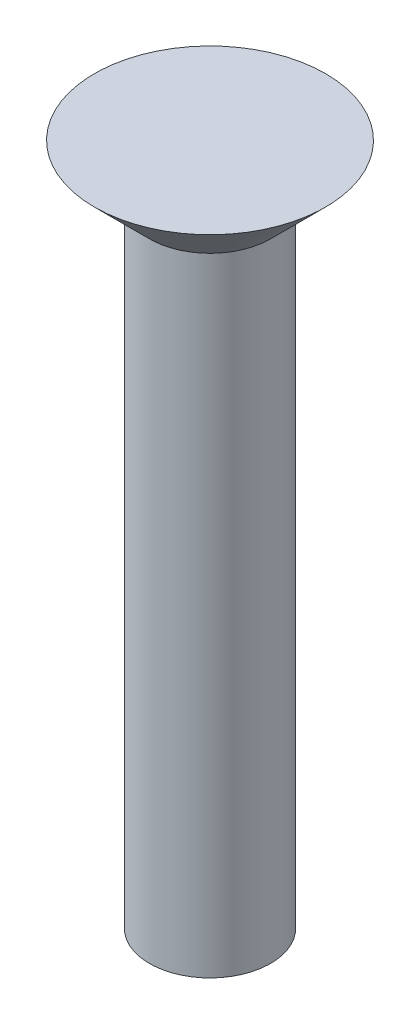
ISO-10303-21;
HEADER;
FILE_DESCRIPTION(('STEP AP214'),'2;1');
FILE_NAME('part.step','',(''),(''),'','','');
FILE_SCHEMA(('AUTOMOTIVE_DESIGN { 1 0 10303 214 1 1 1 1 }'));
ENDSEC;
DATA;
#1=APPLICATION_CONTEXT('core data for automotive mechanical design processes');
#2=APPLICATION_PROTOCOL_DEFINITION('international standard','automotive_design',2000,#1);
#3=PRODUCT_CONTEXT('',#1,'mechanical');
#4=PRODUCT('Part','Part','',(#3));
#5=PRODUCT_RELATED_PRODUCT_CATEGORY('part','',(#4));
#6=PRODUCT_DEFINITION_FORMATION('','',#4);
#7=PRODUCT_DEFINITION_CONTEXT('part definition',#1,'design');
#8=PRODUCT_DEFINITION('design','',#6,#7);
#9=PRODUCT_DEFINITION_SHAPE('','',#8);
#10=(LENGTH_UNIT() NAMED_UNIT(*) SI_UNIT(.MILLI.,.METRE.));
#11=(NAMED_UNIT(*) PLANE_ANGLE_UNIT() SI_UNIT($,.RADIAN.));
#12=(NAMED_UNIT(*) SI_UNIT($,.STERADIAN.) SOLID_ANGLE_UNIT());
#13=UNCERTAINTY_MEASURE_WITH_UNIT(LENGTH_MEASURE(1.E-05),#10,'distance_accuracy_value','');
#14=(GEOMETRIC_REPRESENTATION_CONTEXT(3) GLOBAL_UNCERTAINTY_ASSIGNED_CONTEXT((#13)) GLOBAL_UNIT_ASSIGNED_CONTEXT((#10,
#11,#12)) REPRESENTATION_CONTEXT('',''));
#15=CARTESIAN_POINT('',(0.,0.,0.));
#16=DIRECTION('',(0.,0.,1.));
#17=DIRECTION('',(1.,0.,0.));
#18=AXIS2_PLACEMENT_3D('',#15,#16,#17);
#19=CARTESIAN_POINT('',(1.65,-9.3,0.));
#20=DIRECTION('',(0.,-1.,0.));
#21=DIRECTION('',(0.,0.,-1.));
#22=AXIS2_PLACEMENT_3D('',#19,#20,#21);
#23=PLANE('',#22);
#24=CARTESIAN_POINT('',(0.,-9.3,0.));
#25=DIRECTION('',(0.,-1.,0.));
#26=DIRECTION('',(0.,0.,-1.));
#27=AXIS2_PLACEMENT_3D('',#24,#25,#26);
#28=CIRCLE('',#27,1.65);
#29=CARTESIAN_POINT('',(0.,-9.3,-1.65));
#30=VERTEX_POINT('',#29);
#31=EDGE_CURVE('E49',#30,#30,#28,.T.);
#32=ORIENTED_EDGE('',*,*,#31,.T.);
#33=EDGE_LOOP('',(#32));
#34=FACE_BOUND('',#33,.T.);
#35=ADVANCED_FACE('F37',(#34),#23,.T.);
#36=CARTESIAN_POINT('',(0.,9.3,0.));
#37=DIRECTION('',(0.,1.,0.));
#38=DIRECTION('',(0.,0.,1.));
#39=AXIS2_PLACEMENT_3D('',#36,#37,#38);
#40=PLANE('',#39);
#41=CARTESIAN_POINT('',(0.,9.3,0.));
#42=DIRECTION('',(0.,-1.,0.));
#43=DIRECTION('',(0.,0.,-1.));
#44=AXIS2_PLACEMENT_3D('',#41,#42,#43);
#45=CIRCLE('',#44,3.15);
#46=CARTESIAN_POINT('',(0.,9.3,-3.15));
#47=VERTEX_POINT('',#46);
#48=EDGE_CURVE('E10',#47,#47,#45,.T.);
#49=ORIENTED_EDGE('',*,*,#48,.F.);
#50=EDGE_LOOP('',(#49));
#51=FACE_BOUND('',#50,.T.);
#52=ADVANCED_FACE('F65',(#51),#40,.T.);
#53=CARTESIAN_POINT('',(0.,7.80000000000002,0.));
#54=DIRECTION('',(0.,1.,0.));
#55=DIRECTION('',(0.,0.,1.));
#56=AXIS2_PLACEMENT_3D('',#53,#54,#55);
#57=CONICAL_SURFACE('',#56,1.65,0.785398163397454);
#58=ORIENTED_EDGE('',*,*,#48,.T.);
#59=EDGE_LOOP('',(#58));
#60=FACE_BOUND('',#59,.T.);
#61=CARTESIAN_POINT('',(0.,7.80000000000002,0.));
#62=DIRECTION('',(0.,-1.,0.));
#63=DIRECTION('',(0.,0.,-1.));
#64=AXIS2_PLACEMENT_3D('',#61,#62,#63);
#65=CIRCLE('',#64,1.65);
#66=CARTESIAN_POINT('',(0.,7.80000000000002,-1.65));
#67=VERTEX_POINT('',#66);
#68=EDGE_CURVE('E44',#67,#67,#65,.T.);
#69=ORIENTED_EDGE('',*,*,#68,.F.);
#70=EDGE_LOOP('',(#69));
#71=FACE_BOUND('',#70,.T.);
#72=ADVANCED_FACE('F60',(#60,#71),#57,.T.);
#73=CARTESIAN_POINT('',(0.,-9.3,0.));
#74=DIRECTION('',(0.,-1.,0.));
#75=DIRECTION('',(0.,0.,-1.));
#76=AXIS2_PLACEMENT_3D('',#73,#74,#75);
#77=CYLINDRICAL_SURFACE('',#76,1.65);
#78=ORIENTED_EDGE('',*,*,#68,.T.);
#79=EDGE_LOOP('',(#78));
#80=FACE_BOUND('',#79,.T.);
#81=ORIENTED_EDGE('',*,*,#31,.F.);
#82=EDGE_LOOP('',(#81));
#83=FACE_BOUND('',#82,.T.);
#84=ADVANCED_FACE('F58',(#80,#83),#77,.T.);
#85=CLOSED_SHELL('',(#35,#52,#72,#84));
#86=MANIFOLD_SOLID_BREP('B2',#85);
#87=ADVANCED_BREP_SHAPE_REPRESENTATION('',(#18,#86),#14);
#88=SHAPE_DEFINITION_REPRESENTATION(#9,#87);
ENDSEC;
END-ISO-10303-21;
